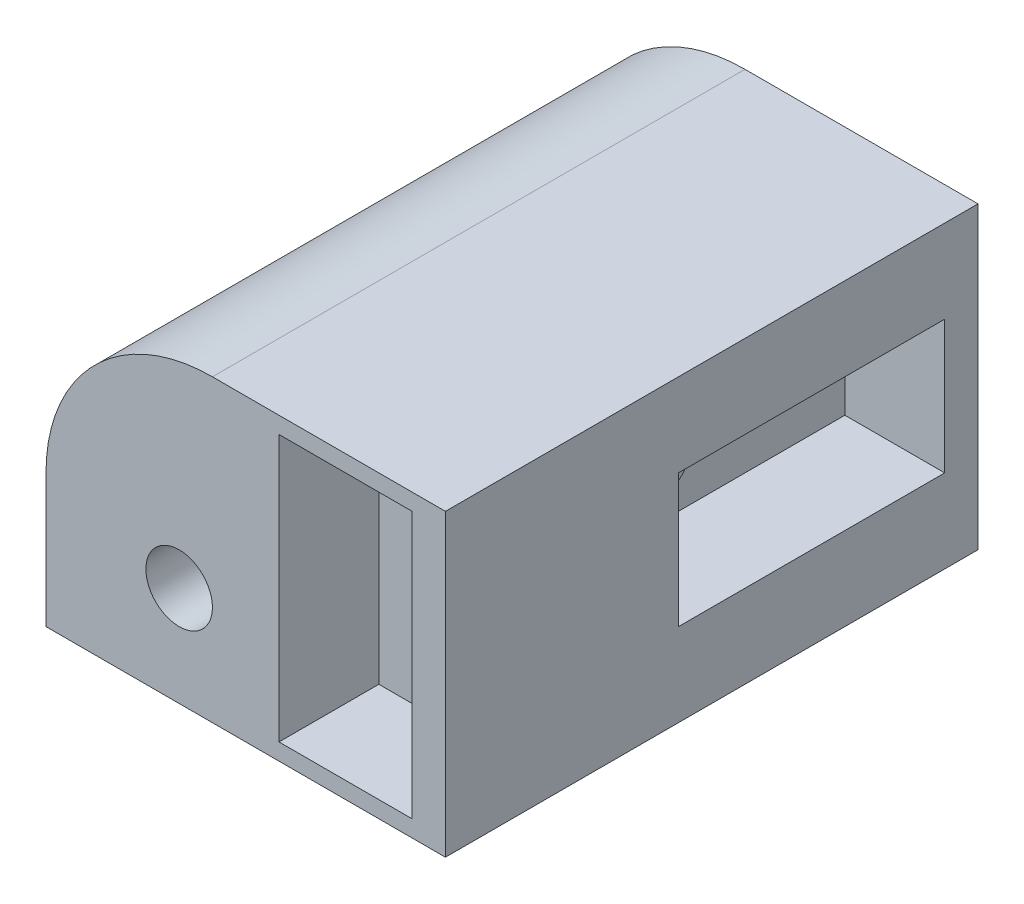
ISO-10303-21;
HEADER;
FILE_DESCRIPTION(('STEP AP214'),'2;1');
FILE_NAME('part.step','',(''),(''),'','','');
FILE_SCHEMA(('AUTOMOTIVE_DESIGN { 1 0 10303 214 1 1 1 1 }'));
ENDSEC;
DATA;
#1=APPLICATION_CONTEXT('core data for automotive mechanical design processes');
#2=APPLICATION_PROTOCOL_DEFINITION('international standard','automotive_design',2000,#1);
#3=PRODUCT_CONTEXT('',#1,'mechanical');
#4=PRODUCT('Part','Part','',(#3));
#5=PRODUCT_RELATED_PRODUCT_CATEGORY('part','',(#4));
#6=PRODUCT_DEFINITION_FORMATION('','',#4);
#7=PRODUCT_DEFINITION_CONTEXT('part definition',#1,'design');
#8=PRODUCT_DEFINITION('design','',#6,#7);
#9=PRODUCT_DEFINITION_SHAPE('','',#8);
#10=(LENGTH_UNIT() NAMED_UNIT(*) SI_UNIT(.MILLI.,.METRE.));
#11=(NAMED_UNIT(*) PLANE_ANGLE_UNIT() SI_UNIT($,.RADIAN.));
#12=(NAMED_UNIT(*) SI_UNIT($,.STERADIAN.) SOLID_ANGLE_UNIT());
#13=UNCERTAINTY_MEASURE_WITH_UNIT(LENGTH_MEASURE(1.E-05),#10,'distance_accuracy_value','');
#14=(GEOMETRIC_REPRESENTATION_CONTEXT(3) GLOBAL_UNCERTAINTY_ASSIGNED_CONTEXT((#13)) GLOBAL_UNIT_ASSIGNED_CONTEXT((#10,
#11,#12)) REPRESENTATION_CONTEXT('',''));
#15=CARTESIAN_POINT('',(0.,0.,0.));
#16=DIRECTION('',(0.,0.,1.));
#17=DIRECTION('',(1.,0.,0.));
#18=AXIS2_PLACEMENT_3D('',#15,#16,#17);
#19=CARTESIAN_POINT('',(14.119038701623,6.69881398252185,101.6));
#20=DIRECTION('',(0.,0.,-1.));
#21=DIRECTION('',(-1.,0.,0.));
#22=AXIS2_PLACEMENT_3D('',#19,#20,#21);
#23=CYLINDRICAL_SURFACE('',#22,31.75);
#24=DIRECTION('',(0.,0.,-1.));
#25=VECTOR('',#24,1.);
#26=CARTESIAN_POINT('',(-17.630961298377,6.69881398252185,101.6));
#27=LINE('',#26,#25);
#28=CARTESIAN_POINT('',(-17.630961298377,6.69881398252185,101.6));
#29=VERTEX_POINT('',#28);
#30=CARTESIAN_POINT('',(-17.630961298377,6.69881398252185,0.));
#31=VERTEX_POINT('',#30);
#32=EDGE_CURVE('E281',#29,#31,#27,.T.);
#33=ORIENTED_EDGE('',*,*,#32,.F.);
#34=CARTESIAN_POINT('',(14.119038701623,6.69881398252185,101.6));
#35=DIRECTION('',(0.,0.,1.));
#36=DIRECTION('',(1.,0.,0.));
#37=AXIS2_PLACEMENT_3D('',#34,#35,#36);
#38=CIRCLE('',#37,31.75);
#39=CARTESIAN_POINT('',(14.119038701623,38.4488139825219,101.6));
#40=VERTEX_POINT('',#39);
#41=EDGE_CURVE('E47',#40,#29,#38,.T.);
#42=ORIENTED_EDGE('',*,*,#41,.F.);
#43=DIRECTION('',(0.,0.,-1.));
#44=VECTOR('',#43,1.);
#45=CARTESIAN_POINT('',(14.119038701623,38.4488139825219,101.6));
#46=LINE('',#45,#44);
#47=CARTESIAN_POINT('',(14.119038701623,38.4488139825219,0.));
#48=VERTEX_POINT('',#47);
#49=EDGE_CURVE('E285',#48,#40,#46,.F.);
#50=ORIENTED_EDGE('',*,*,#49,.F.);
#51=CARTESIAN_POINT('',(14.119038701623,6.69881398252185,0.));
#52=DIRECTION('',(0.,0.,1.));
#53=DIRECTION('',(1.,0.,0.));
#54=AXIS2_PLACEMENT_3D('',#51,#52,#53);
#55=CIRCLE('',#54,31.75);
#56=EDGE_CURVE('E11',#31,#48,#55,.F.);
#57=ORIENTED_EDGE('',*,*,#56,.F.);
#58=EDGE_LOOP('',(#33,#42,#50,#57));
#59=FACE_BOUND('',#58,.T.);
#60=ADVANCED_FACE('F39',(#59),#23,.T.);
#61=CARTESIAN_POINT('',(58.569038701623,38.4488139825219,101.6));
#62=DIRECTION('',(-1.,0.,0.));
#63=DIRECTION('',(0.,-1.,0.));
#64=AXIS2_PLACEMENT_3D('',#61,#62,#63);
#65=PLANE('',#64);
#66=DIRECTION('',(0.,1.,0.));
#67=VECTOR('',#66,1.);
#68=CARTESIAN_POINT('',(58.569038701623,38.4488139825219,0.));
#69=LINE('',#68,#67);
#70=CARTESIAN_POINT('',(58.569038701623,-18.7011860174781,0.));
#71=VERTEX_POINT('',#70);
#72=CARTESIAN_POINT('',(58.569038701623,38.4488139825219,0.));
#73=VERTEX_POINT('',#72);
#74=EDGE_CURVE('E260',#71,#73,#69,.T.);
#75=ORIENTED_EDGE('',*,*,#74,.T.);
#76=DIRECTION('',(0.,0.,-1.));
#77=VECTOR('',#76,1.);
#78=CARTESIAN_POINT('',(58.569038701623,38.4488139825219,101.6));
#79=LINE('',#78,#77);
#80=CARTESIAN_POINT('',(58.569038701623,38.4488139825219,101.6));
#81=VERTEX_POINT('',#80);
#82=EDGE_CURVE('E254',#81,#73,#79,.T.);
#83=ORIENTED_EDGE('',*,*,#82,.F.);
#84=DIRECTION('',(0.,1.,0.));
#85=VECTOR('',#84,1.);
#86=CARTESIAN_POINT('',(58.569038701623,38.4488139825219,101.6));
#87=LINE('',#86,#85);
#88=CARTESIAN_POINT('',(58.569038701623,-18.7011860174781,101.6));
#89=VERTEX_POINT('',#88);
#90=EDGE_CURVE('E247',#89,#81,#87,.T.);
#91=ORIENTED_EDGE('',*,*,#90,.F.);
#92=DIRECTION('',(0.,0.,-1.));
#93=VECTOR('',#92,1.);
#94=CARTESIAN_POINT('',(58.569038701623,-18.7011860174781,101.6));
#95=LINE('',#94,#93);
#96=EDGE_CURVE('E269',#89,#71,#95,.T.);
#97=ORIENTED_EDGE('',*,*,#96,.T.);
#98=EDGE_LOOP('',(#75,#83,#91,#97));
#99=FACE_BOUND('',#98,.T.);
#100=DIRECTION('',(0.,-1.,0.));
#101=VECTOR('',#100,1.);
#102=CARTESIAN_POINT('',(58.569038701623,22.5738139825219,6.35));
#103=LINE('',#102,#101);
#104=CARTESIAN_POINT('',(58.569038701623,22.5738139825219,6.34999999999999));
#105=VERTEX_POINT('',#104);
#106=CARTESIAN_POINT('',(58.569038701623,-2.82618601747811,6.35));
#107=VERTEX_POINT('',#106);
#108=EDGE_CURVE('E183',#105,#107,#103,.T.);
#109=ORIENTED_EDGE('',*,*,#108,.T.);
#110=DIRECTION('',(0.,0.,1.));
#111=VECTOR('',#110,1.);
#112=CARTESIAN_POINT('',(58.569038701623,-2.82618601747811,6.35));
#113=LINE('',#112,#111);
#114=CARTESIAN_POINT('',(58.569038701623,-2.82618601747811,57.15));
#115=VERTEX_POINT('',#114);
#116=EDGE_CURVE('E207',#107,#115,#113,.T.);
#117=ORIENTED_EDGE('',*,*,#116,.T.);
#118=DIRECTION('',(0.,1.,0.));
#119=VECTOR('',#118,1.);
#120=CARTESIAN_POINT('',(58.569038701623,22.5738139825219,57.15));
#121=LINE('',#120,#119);
#122=CARTESIAN_POINT('',(58.569038701623,22.5738139825219,57.15));
#123=VERTEX_POINT('',#122);
#124=EDGE_CURVE('E211',#115,#123,#121,.T.);
#125=ORIENTED_EDGE('',*,*,#124,.T.);
#126=DIRECTION('',(0.,0.,-1.));
#127=VECTOR('',#126,1.);
#128=CARTESIAN_POINT('',(58.569038701623,22.5738139825219,6.35));
#129=LINE('',#128,#127);
#130=EDGE_CURVE('E194',#123,#105,#129,.T.);
#131=ORIENTED_EDGE('',*,*,#130,.T.);
#132=EDGE_LOOP('',(#109,#117,#125,#131));
#133=FACE_BOUND('',#132,.T.);
#134=ADVANCED_FACE('F304',(#99,#133),#65,.F.);
#135=CARTESIAN_POINT('',(0.,0.,101.6));
#136=DIRECTION('',(0.,0.,1.));
#137=DIRECTION('',(1.,0.,0.));
#138=AXIS2_PLACEMENT_3D('',#135,#136,#137);
#139=PLANE('',#138);
#140=DIRECTION('',(0.,-1.,0.));
#141=VECTOR('',#140,1.);
#142=CARTESIAN_POINT('',(26.819038701623,35.2738139825219,101.6));
#143=LINE('',#142,#141);
#144=CARTESIAN_POINT('',(26.819038701623,35.2738139825219,101.6));
#145=VERTEX_POINT('',#144);
#146=CARTESIAN_POINT('',(26.819038701623,-15.5261860174781,101.6));
#147=VERTEX_POINT('',#146);
#148=EDGE_CURVE('E139',#145,#147,#143,.T.);
#149=ORIENTED_EDGE('',*,*,#148,.F.);
#150=DIRECTION('',(-1.,0.,0.));
#151=VECTOR('',#150,1.);
#152=CARTESIAN_POINT('',(26.819038701623,35.2738139825219,101.6));
#153=LINE('',#152,#151);
#154=CARTESIAN_POINT('',(52.219038701623,35.2738139825219,101.6));
#155=VERTEX_POINT('',#154);
#156=EDGE_CURVE('E159',#155,#145,#153,.T.);
#157=ORIENTED_EDGE('',*,*,#156,.F.);
#158=DIRECTION('',(0.,1.,0.));
#159=VECTOR('',#158,1.);
#160=CARTESIAN_POINT('',(52.219038701623,35.2738139825219,101.6));
#161=LINE('',#160,#159);
#162=CARTESIAN_POINT('',(52.219038701623,-15.5261860174781,101.6));
#163=VERTEX_POINT('',#162);
#164=EDGE_CURVE('E163',#163,#155,#161,.T.);
#165=ORIENTED_EDGE('',*,*,#164,.F.);
#166=DIRECTION('',(1.,0.,0.));
#167=VECTOR('',#166,1.);
#168=CARTESIAN_POINT('',(26.819038701623,-15.5261860174781,101.6));
#169=LINE('',#168,#167);
#170=EDGE_CURVE('E174',#147,#163,#169,.T.);
#171=ORIENTED_EDGE('',*,*,#170,.F.);
#172=EDGE_LOOP('',(#149,#157,#165,#171));
#173=FACE_BOUND('',#172,.T.);
#174=DIRECTION('',(-1.,0.,0.));
#175=VECTOR('',#174,1.);
#176=CARTESIAN_POINT('',(-17.630961298377,38.4488139825219,101.6));
#177=LINE('',#176,#175);
#178=EDGE_CURVE('E250',#81,#40,#177,.T.);
#179=ORIENTED_EDGE('',*,*,#178,.T.);
#180=ORIENTED_EDGE('',*,*,#41,.T.);
#181=DIRECTION('',(0.,-1.,0.));
#182=VECTOR('',#181,1.);
#183=CARTESIAN_POINT('',(-17.630961298377,38.4488139825219,101.6));
#184=LINE('',#183,#182);
#185=CARTESIAN_POINT('',(-17.630961298377,-18.7011860174781,101.6));
#186=VERTEX_POINT('',#185);
#187=EDGE_CURVE('E240',#29,#186,#184,.T.);
#188=ORIENTED_EDGE('',*,*,#187,.T.);
#189=DIRECTION('',(1.,0.,0.));
#190=VECTOR('',#189,1.);
#191=CARTESIAN_POINT('',(-17.630961298377,-18.7011860174781,101.6));
#192=LINE('',#191,#190);
#193=EDGE_CURVE('E243',#186,#89,#192,.T.);
#194=ORIENTED_EDGE('',*,*,#193,.T.);
#195=ORIENTED_EDGE('',*,*,#90,.T.);
#196=EDGE_LOOP('',(#179,#180,#188,#194,#195));
#197=FACE_BOUND('',#196,.T.);
#198=CARTESIAN_POINT('',(7.76903870162297,0.348813982521855,101.6));
#199=DIRECTION('',(0.,0.,1.));
#200=DIRECTION('',(1.,0.,0.));
#201=AXIS2_PLACEMENT_3D('',#198,#199,#200);
#202=CIRCLE('',#201,6.35);
#203=CARTESIAN_POINT('',(14.119038701623,0.348813982521855,101.6));
#204=VERTEX_POINT('',#203);
#205=EDGE_CURVE('E232',#204,#204,#202,.T.);
#206=ORIENTED_EDGE('',*,*,#205,.F.);
#207=EDGE_LOOP('',(#206));
#208=FACE_BOUND('',#207,.T.);
#209=ADVANCED_FACE('F289',(#173,#197,#208),#139,.T.);
#210=CARTESIAN_POINT('',(0.,0.,0.));
#211=DIRECTION('',(0.,0.,1.));
#212=DIRECTION('',(1.,0.,0.));
#213=AXIS2_PLACEMENT_3D('',#210,#211,#212);
#214=PLANE('',#213);
#215=DIRECTION('',(0.,-1.,0.));
#216=VECTOR('',#215,1.);
#217=CARTESIAN_POINT('',(-17.630961298377,38.4488139825219,0.));
#218=LINE('',#217,#216);
#219=CARTESIAN_POINT('',(-17.630961298377,-18.7011860174781,0.));
#220=VERTEX_POINT('',#219);
#221=EDGE_CURVE('E236',#31,#220,#218,.T.);
#222=ORIENTED_EDGE('',*,*,#221,.F.);
#223=ORIENTED_EDGE('',*,*,#56,.T.);
#224=DIRECTION('',(-1.,0.,0.));
#225=VECTOR('',#224,1.);
#226=CARTESIAN_POINT('',(-17.630961298377,38.4488139825219,0.));
#227=LINE('',#226,#225);
#228=EDGE_CURVE('E244',#73,#48,#227,.T.);
#229=ORIENTED_EDGE('',*,*,#228,.F.);
#230=ORIENTED_EDGE('',*,*,#74,.F.);
#231=DIRECTION('',(1.,0.,0.));
#232=VECTOR('',#231,1.);
#233=CARTESIAN_POINT('',(-17.630961298377,-18.7011860174781,0.));
#234=LINE('',#233,#232);
#235=EDGE_CURVE('E257',#220,#71,#234,.T.);
#236=ORIENTED_EDGE('',*,*,#235,.F.);
#237=EDGE_LOOP('',(#222,#223,#229,#230,#236));
#238=FACE_BOUND('',#237,.T.);
#239=CARTESIAN_POINT('',(7.76903870162297,0.348813982521855,0.));
#240=DIRECTION('',(0.,0.,1.));
#241=DIRECTION('',(1.,0.,0.));
#242=AXIS2_PLACEMENT_3D('',#239,#240,#241);
#243=CIRCLE('',#242,6.35);
#244=CARTESIAN_POINT('',(14.119038701623,0.348813982521855,0.));
#245=VERTEX_POINT('',#244);
#246=EDGE_CURVE('E231',#245,#245,#243,.T.);
#247=ORIENTED_EDGE('',*,*,#246,.T.);
#248=EDGE_LOOP('',(#247));
#249=FACE_BOUND('',#248,.T.);
#250=ADVANCED_FACE('F309',(#238,#249),#214,.F.);
#251=CARTESIAN_POINT('',(-17.630961298377,38.4488139825219,101.6));
#252=DIRECTION('',(1.,0.,0.));
#253=DIRECTION('',(0.,1.,0.));
#254=AXIS2_PLACEMENT_3D('',#251,#252,#253);
#255=PLANE('',#254);
#256=ORIENTED_EDGE('',*,*,#187,.F.);
#257=ORIENTED_EDGE('',*,*,#32,.T.);
#258=ORIENTED_EDGE('',*,*,#221,.T.);
#259=DIRECTION('',(0.,0.,-1.));
#260=VECTOR('',#259,1.);
#261=CARTESIAN_POINT('',(-17.630961298377,-18.7011860174781,101.6));
#262=LINE('',#261,#260);
#263=EDGE_CURVE('E273',#186,#220,#262,.T.);
#264=ORIENTED_EDGE('',*,*,#263,.F.);
#265=EDGE_LOOP('',(#256,#257,#258,#264));
#266=FACE_BOUND('',#265,.T.);
#267=ADVANCED_FACE('F296',(#266),#255,.F.);
#268=CARTESIAN_POINT('',(-17.630961298377,-18.7011860174781,101.6));
#269=DIRECTION('',(0.,1.,0.));
#270=DIRECTION('',(0.,0.,1.));
#271=AXIS2_PLACEMENT_3D('',#268,#269,#270);
#272=PLANE('',#271);
#273=ORIENTED_EDGE('',*,*,#235,.T.);
#274=ORIENTED_EDGE('',*,*,#96,.F.);
#275=ORIENTED_EDGE('',*,*,#193,.F.);
#276=ORIENTED_EDGE('',*,*,#263,.T.);
#277=EDGE_LOOP('',(#273,#274,#275,#276));
#278=FACE_BOUND('',#277,.T.);
#279=ADVANCED_FACE('F299',(#278),#272,.F.);
#280=CARTESIAN_POINT('',(-17.630961298377,38.4488139825219,101.6));
#281=DIRECTION('',(0.,-1.,0.));
#282=DIRECTION('',(0.,0.,-1.));
#283=AXIS2_PLACEMENT_3D('',#280,#281,#282);
#284=PLANE('',#283);
#285=ORIENTED_EDGE('',*,*,#228,.T.);
#286=ORIENTED_EDGE('',*,*,#49,.T.);
#287=ORIENTED_EDGE('',*,*,#178,.F.);
#288=ORIENTED_EDGE('',*,*,#82,.T.);
#289=EDGE_LOOP('',(#285,#286,#287,#288));
#290=FACE_BOUND('',#289,.T.);
#291=ADVANCED_FACE('F308',(#290),#284,.F.);
#292=CARTESIAN_POINT('',(7.76903870162297,0.348813982521855,101.6));
#293=DIRECTION('',(0.,0.,-1.));
#294=DIRECTION('',(-1.,0.,0.));
#295=AXIS2_PLACEMENT_3D('',#292,#293,#294);
#296=CYLINDRICAL_SURFACE('',#295,6.35);
#297=ORIENTED_EDGE('',*,*,#205,.T.);
#298=EDGE_LOOP('',(#297));
#299=FACE_BOUND('',#298,.T.);
#300=ORIENTED_EDGE('',*,*,#246,.F.);
#301=EDGE_LOOP('',(#300));
#302=FACE_BOUND('',#301,.T.);
#303=ADVANCED_FACE('F315',(#299,#302),#296,.F.);
#304=CARTESIAN_POINT('',(39.519038701623,22.5738139825219,6.35));
#305=DIRECTION('',(0.,0.,1.));
#306=DIRECTION('',(0.,-1.,0.));
#307=AXIS2_PLACEMENT_3D('',#304,#305,#306);
#308=PLANE('',#307);
#309=ORIENTED_EDGE('',*,*,#108,.F.);
#310=DIRECTION('',(1.,0.,0.));
#311=VECTOR('',#310,1.);
#312=CARTESIAN_POINT('',(39.519038701623,22.5738139825219,6.35));
#313=LINE('',#312,#311);
#314=CARTESIAN_POINT('',(39.519038701623,22.5738139825219,6.35));
#315=VERTEX_POINT('',#314);
#316=EDGE_CURVE('E203',#315,#105,#313,.T.);
#317=ORIENTED_EDGE('',*,*,#316,.F.);
#318=DIRECTION('',(0.,-1.,0.));
#319=VECTOR('',#318,1.);
#320=CARTESIAN_POINT('',(39.519038701623,22.5738139825219,6.35));
#321=LINE('',#320,#319);
#322=CARTESIAN_POINT('',(39.519038701623,-2.82618601747812,6.35));
#323=VERTEX_POINT('',#322);
#324=EDGE_CURVE('E189',#315,#323,#321,.T.);
#325=ORIENTED_EDGE('',*,*,#324,.T.);
#326=DIRECTION('',(1.,0.,0.));
#327=VECTOR('',#326,1.);
#328=CARTESIAN_POINT('',(39.519038701623,-2.82618601747812,6.35));
#329=LINE('',#328,#327);
#330=EDGE_CURVE('E227',#323,#107,#329,.T.);
#331=ORIENTED_EDGE('',*,*,#330,.T.);
#332=EDGE_LOOP('',(#309,#317,#325,#331));
#333=FACE_BOUND('',#332,.T.);
#334=ADVANCED_FACE('F317',(#333),#308,.T.);
#335=CARTESIAN_POINT('',(39.519038701623,-2.82618601747812,6.35));
#336=DIRECTION('',(0.,1.,0.));
#337=DIRECTION('',(-1.,0.,0.));
#338=AXIS2_PLACEMENT_3D('',#335,#336,#337);
#339=PLANE('',#338);
#340=ORIENTED_EDGE('',*,*,#116,.F.);
#341=ORIENTED_EDGE('',*,*,#330,.F.);
#342=DIRECTION('',(0.,0.,1.));
#343=VECTOR('',#342,1.);
#344=CARTESIAN_POINT('',(39.519038701623,-2.82618601747812,6.35));
#345=LINE('',#344,#343);
#346=CARTESIAN_POINT('',(39.519038701623,-2.82618601747812,57.15));
#347=VERTEX_POINT('',#346);
#348=EDGE_CURVE('E193',#323,#347,#345,.T.);
#349=ORIENTED_EDGE('',*,*,#348,.T.);
#350=DIRECTION('',(1.,0.,0.));
#351=VECTOR('',#350,1.);
#352=CARTESIAN_POINT('',(39.519038701623,-2.82618601747812,57.15));
#353=LINE('',#352,#351);
#354=EDGE_CURVE('E224',#347,#115,#353,.T.);
#355=ORIENTED_EDGE('',*,*,#354,.T.);
#356=EDGE_LOOP('',(#340,#341,#349,#355));
#357=FACE_BOUND('',#356,.T.);
#358=ADVANCED_FACE('F324',(#357),#339,.T.);
#359=CARTESIAN_POINT('',(39.519038701623,22.5738139825219,57.15));
#360=DIRECTION('',(0.,0.,-1.));
#361=DIRECTION('',(0.,1.,0.));
#362=AXIS2_PLACEMENT_3D('',#359,#360,#361);
#363=PLANE('',#362);
#364=ORIENTED_EDGE('',*,*,#124,.F.);
#365=ORIENTED_EDGE('',*,*,#354,.F.);
#366=DIRECTION('',(0.,1.,0.));
#367=VECTOR('',#366,1.);
#368=CARTESIAN_POINT('',(39.519038701623,22.5738139825219,57.15));
#369=LINE('',#368,#367);
#370=CARTESIAN_POINT('',(39.519038701623,22.5738139825219,57.15));
#371=VERTEX_POINT('',#370);
#372=EDGE_CURVE('E197',#347,#371,#369,.T.);
#373=ORIENTED_EDGE('',*,*,#372,.T.);
#374=DIRECTION('',(1.,0.,0.));
#375=VECTOR('',#374,1.);
#376=CARTESIAN_POINT('',(39.519038701623,22.5738139825219,57.15));
#377=LINE('',#376,#375);
#378=EDGE_CURVE('E221',#371,#123,#377,.T.);
#379=ORIENTED_EDGE('',*,*,#378,.T.);
#380=EDGE_LOOP('',(#364,#365,#373,#379));
#381=FACE_BOUND('',#380,.T.);
#382=ADVANCED_FACE('F378',(#381),#363,.T.);
#383=CARTESIAN_POINT('',(39.519038701623,22.5738139825219,6.35));
#384=DIRECTION('',(0.,-1.,0.));
#385=DIRECTION('',(1.,0.,0.));
#386=AXIS2_PLACEMENT_3D('',#383,#384,#385);
#387=PLANE('',#386);
#388=ORIENTED_EDGE('',*,*,#130,.F.);
#389=ORIENTED_EDGE('',*,*,#378,.F.);
#390=DIRECTION('',(0.,0.,-1.));
#391=VECTOR('',#390,1.);
#392=CARTESIAN_POINT('',(39.519038701623,22.5738139825219,6.35));
#393=LINE('',#392,#391);
#394=EDGE_CURVE('E200',#371,#315,#393,.T.);
#395=ORIENTED_EDGE('',*,*,#394,.T.);
#396=ORIENTED_EDGE('',*,*,#316,.T.);
#397=EDGE_LOOP('',(#388,#389,#395,#396));
#398=FACE_BOUND('',#397,.T.);
#399=ADVANCED_FACE('F387',(#398),#387,.T.);
#400=CARTESIAN_POINT('',(39.519038701623,0.,0.));
#401=DIRECTION('',(-1.,0.,0.));
#402=DIRECTION('',(0.,-1.,0.));
#403=AXIS2_PLACEMENT_3D('',#400,#401,#402);
#404=PLANE('',#403);
#405=CARTESIAN_POINT('',(39.519038701623,9.87381398252188,44.45));
#406=DIRECTION('',(-1.,0.,0.));
#407=DIRECTION('',(0.,-1.,0.));
#408=AXIS2_PLACEMENT_3D('',#405,#406,#407);
#409=CIRCLE('',#408,6.35000000000001);
#410=CARTESIAN_POINT('',(39.519038701623,3.52381398252187,44.45));
#411=VERTEX_POINT('',#410);
#412=EDGE_CURVE('E277',#411,#411,#409,.F.);
#413=ORIENTED_EDGE('',*,*,#412,.F.);
#414=EDGE_LOOP('',(#413));
#415=FACE_BOUND('',#414,.T.);
#416=ORIENTED_EDGE('',*,*,#324,.F.);
#417=ORIENTED_EDGE('',*,*,#394,.F.);
#418=ORIENTED_EDGE('',*,*,#372,.F.);
#419=ORIENTED_EDGE('',*,*,#348,.F.);
#420=EDGE_LOOP('',(#416,#417,#418,#419));
#421=FACE_BOUND('',#420,.T.);
#422=ADVANCED_FACE('F396',(#415,#421),#404,.F.);
#423=CARTESIAN_POINT('',(26.819038701623,35.2738139825219,82.55));
#424=DIRECTION('',(-1.,0.,0.));
#425=DIRECTION('',(0.,-1.,0.));
#426=AXIS2_PLACEMENT_3D('',#423,#424,#425);
#427=PLANE('',#426);
#428=ORIENTED_EDGE('',*,*,#148,.T.);
#429=DIRECTION('',(0.,0.,1.));
#430=VECTOR('',#429,1.);
#431=CARTESIAN_POINT('',(26.819038701623,-15.5261860174781,82.55));
#432=LINE('',#431,#430);
#433=CARTESIAN_POINT('',(26.819038701623,-15.5261860174781,82.55));
#434=VERTEX_POINT('',#433);
#435=EDGE_CURVE('E132',#434,#147,#432,.T.);
#436=ORIENTED_EDGE('',*,*,#435,.F.);
#437=DIRECTION('',(0.,-1.,0.));
#438=VECTOR('',#437,1.);
#439=CARTESIAN_POINT('',(26.819038701623,35.2738139825219,82.55));
#440=LINE('',#439,#438);
#441=CARTESIAN_POINT('',(26.819038701623,35.2738139825219,82.55));
#442=VERTEX_POINT('',#441);
#443=EDGE_CURVE('E136',#442,#434,#440,.T.);
#444=ORIENTED_EDGE('',*,*,#443,.F.);
#445=DIRECTION('',(0.,0.,1.));
#446=VECTOR('',#445,1.);
#447=CARTESIAN_POINT('',(26.819038701623,35.2738139825219,82.55));
#448=LINE('',#447,#446);
#449=EDGE_CURVE('E180',#442,#145,#448,.T.);
#450=ORIENTED_EDGE('',*,*,#449,.T.);
#451=EDGE_LOOP('',(#428,#436,#444,#450));
#452=FACE_BOUND('',#451,.T.);
#453=ADVANCED_FACE('F134',(#452),#427,.F.);
#454=CARTESIAN_POINT('',(26.819038701623,35.2738139825219,82.55));
#455=DIRECTION('',(0.,1.,0.));
#456=DIRECTION('',(0.,0.,1.));
#457=AXIS2_PLACEMENT_3D('',#454,#455,#456);
#458=PLANE('',#457);
#459=ORIENTED_EDGE('',*,*,#156,.T.);
#460=ORIENTED_EDGE('',*,*,#449,.F.);
#461=DIRECTION('',(-1.,0.,0.));
#462=VECTOR('',#461,1.);
#463=CARTESIAN_POINT('',(26.819038701623,35.2738139825219,82.55));
#464=LINE('',#463,#462);
#465=CARTESIAN_POINT('',(52.219038701623,35.2738139825219,82.55));
#466=VERTEX_POINT('',#465);
#467=EDGE_CURVE('E145',#466,#442,#464,.T.);
#468=ORIENTED_EDGE('',*,*,#467,.F.);
#469=DIRECTION('',(0.,0.,1.));
#470=VECTOR('',#469,1.);
#471=CARTESIAN_POINT('',(52.219038701623,35.2738139825219,82.55));
#472=LINE('',#471,#470);
#473=EDGE_CURVE('E184',#466,#155,#472,.T.);
#474=ORIENTED_EDGE('',*,*,#473,.T.);
#475=EDGE_LOOP('',(#459,#460,#468,#474));
#476=FACE_BOUND('',#475,.T.);
#477=ADVANCED_FACE('F415',(#476),#458,.F.);
#478=CARTESIAN_POINT('',(52.219038701623,35.2738139825219,82.55));
#479=DIRECTION('',(1.,0.,0.));
#480=DIRECTION('',(0.,1.,0.));
#481=AXIS2_PLACEMENT_3D('',#478,#479,#480);
#482=PLANE('',#481);
#483=ORIENTED_EDGE('',*,*,#164,.T.);
#484=ORIENTED_EDGE('',*,*,#473,.F.);
#485=DIRECTION('',(0.,1.,0.));
#486=VECTOR('',#485,1.);
#487=CARTESIAN_POINT('',(52.219038701623,35.2738139825219,82.55));
#488=LINE('',#487,#486);
#489=CARTESIAN_POINT('',(52.219038701623,-15.5261860174781,82.55));
#490=VERTEX_POINT('',#489);
#491=EDGE_CURVE('E154',#490,#466,#488,.T.);
#492=ORIENTED_EDGE('',*,*,#491,.F.);
#493=DIRECTION('',(0.,0.,1.));
#494=VECTOR('',#493,1.);
#495=CARTESIAN_POINT('',(52.219038701623,-15.5261860174781,82.55));
#496=LINE('',#495,#494);
#497=EDGE_CURVE('E144',#490,#163,#496,.T.);
#498=ORIENTED_EDGE('',*,*,#497,.T.);
#499=EDGE_LOOP('',(#483,#484,#492,#498));
#500=FACE_BOUND('',#499,.T.);
#501=ADVANCED_FACE('F423',(#500),#482,.F.);
#502=CARTESIAN_POINT('',(26.819038701623,-15.5261860174781,82.55));
#503=DIRECTION('',(0.,-1.,0.));
#504=DIRECTION('',(0.,0.,-1.));
#505=AXIS2_PLACEMENT_3D('',#502,#503,#504);
#506=PLANE('',#505);
#507=ORIENTED_EDGE('',*,*,#170,.T.);
#508=ORIENTED_EDGE('',*,*,#497,.F.);
#509=DIRECTION('',(1.,0.,0.));
#510=VECTOR('',#509,1.);
#511=CARTESIAN_POINT('',(26.819038701623,-15.5261860174781,82.55));
#512=LINE('',#511,#510);
#513=EDGE_CURVE('E148',#434,#490,#512,.T.);
#514=ORIENTED_EDGE('',*,*,#513,.F.);
#515=ORIENTED_EDGE('',*,*,#435,.T.);
#516=EDGE_LOOP('',(#507,#508,#514,#515));
#517=FACE_BOUND('',#516,.T.);
#518=ADVANCED_FACE('F149',(#517),#506,.F.);
#519=CARTESIAN_POINT('',(0.,0.,82.55));
#520=DIRECTION('',(0.,0.,1.));
#521=DIRECTION('',(1.,0.,0.));
#522=AXIS2_PLACEMENT_3D('',#519,#520,#521);
#523=PLANE('',#522);
#524=ORIENTED_EDGE('',*,*,#443,.T.);
#525=ORIENTED_EDGE('',*,*,#513,.T.);
#526=ORIENTED_EDGE('',*,*,#491,.T.);
#527=ORIENTED_EDGE('',*,*,#467,.T.);
#528=EDGE_LOOP('',(#524,#525,#526,#527));
#529=FACE_BOUND('',#528,.T.);
#530=ADVANCED_FACE('F156',(#529),#523,.T.);
#531=CARTESIAN_POINT('',(42.059038701623,9.87381398252188,44.45));
#532=DIRECTION('',(-1.,0.,0.));
#533=DIRECTION('',(0.,-1.,0.));
#534=AXIS2_PLACEMENT_3D('',#531,#532,#533);
#535=CYLINDRICAL_SURFACE('',#534,6.35000000000001);
#536=CARTESIAN_POINT('',(42.059038701623,9.87381398252188,44.45));
#537=DIRECTION('',(1.,0.,0.));
#538=DIRECTION('',(0.,1.,0.));
#539=AXIS2_PLACEMENT_3D('',#536,#537,#538);
#540=CIRCLE('',#539,6.35000000000001);
#541=CARTESIAN_POINT('',(42.059038701623,16.2238139825219,44.45));
#542=VERTEX_POINT('',#541);
#543=EDGE_CURVE('E166',#542,#542,#540,.T.);
#544=ORIENTED_EDGE('',*,*,#543,.F.);
#545=EDGE_LOOP('',(#544));
#546=FACE_BOUND('',#545,.T.);
#547=ORIENTED_EDGE('',*,*,#412,.T.);
#548=EDGE_LOOP('',(#547));
#549=FACE_BOUND('',#548,.T.);
#550=ADVANCED_FACE('F446',(#546,#549),#535,.T.);
#551=CARTESIAN_POINT('',(42.059038701623,9.87381398252188,44.45));
#552=DIRECTION('',(1.,0.,0.));
#553=DIRECTION('',(0.,1.,0.));
#554=AXIS2_PLACEMENT_3D('',#551,#552,#553);
#555=PLANE('',#554);
#556=ORIENTED_EDGE('',*,*,#543,.T.);
#557=EDGE_LOOP('',(#556));
#558=FACE_BOUND('',#557,.T.);
#559=ADVANCED_FACE('F453',(#558),#555,.T.);
#560=CLOSED_SHELL('',(#60,#134,#209,#250,#267,#279,#291,#303,#334,#358,#382,#399,#422,#453,#477,
#501,#518,#530,#550,#559));
#561=MANIFOLD_SOLID_BREP('B2',#560);
#562=ADVANCED_BREP_SHAPE_REPRESENTATION('',(#18,#561),#14);
#563=SHAPE_DEFINITION_REPRESENTATION(#9,#562);
ENDSEC;
END-ISO-10303-21;
